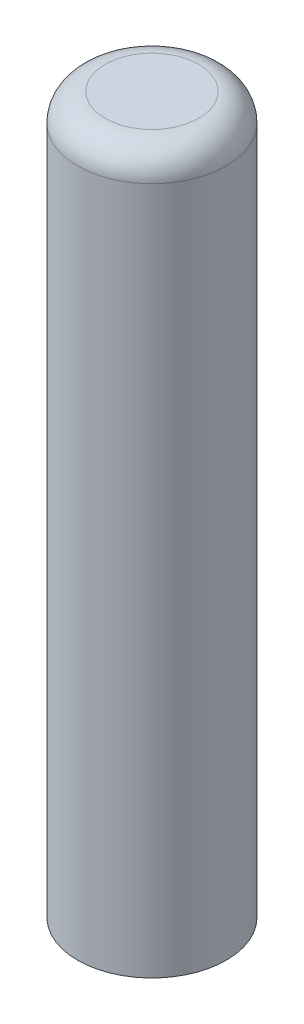
ISO-10303-21;
HEADER;
FILE_DESCRIPTION(('STEP AP214'),'2;1');
FILE_NAME('part.step','',(''),(''),'','','');
FILE_SCHEMA(('AUTOMOTIVE_DESIGN { 1 0 10303 214 1 1 1 1 }'));
ENDSEC;
DATA;
#1=APPLICATION_CONTEXT('core data for automotive mechanical design processes');
#2=APPLICATION_PROTOCOL_DEFINITION('international standard','automotive_design',2000,#1);
#3=PRODUCT_CONTEXT('',#1,'mechanical');
#4=PRODUCT('Part','Part','',(#3));
#5=PRODUCT_RELATED_PRODUCT_CATEGORY('part','',(#4));
#6=PRODUCT_DEFINITION_FORMATION('','',#4);
#7=PRODUCT_DEFINITION_CONTEXT('part definition',#1,'design');
#8=PRODUCT_DEFINITION('design','',#6,#7);
#9=PRODUCT_DEFINITION_SHAPE('','',#8);
#10=(LENGTH_UNIT() NAMED_UNIT(*) SI_UNIT(.MILLI.,.METRE.));
#11=(NAMED_UNIT(*) PLANE_ANGLE_UNIT() SI_UNIT($,.RADIAN.));
#12=(NAMED_UNIT(*) SI_UNIT($,.STERADIAN.) SOLID_ANGLE_UNIT());
#13=UNCERTAINTY_MEASURE_WITH_UNIT(LENGTH_MEASURE(1.E-05),#10,'distance_accuracy_value','');
#14=(GEOMETRIC_REPRESENTATION_CONTEXT(3) GLOBAL_UNCERTAINTY_ASSIGNED_CONTEXT((#13)) GLOBAL_UNIT_ASSIGNED_CONTEXT((#10,
#11,#12)) REPRESENTATION_CONTEXT('',''));
#15=CARTESIAN_POINT('',(0.,0.,0.));
#16=DIRECTION('',(0.,0.,1.));
#17=DIRECTION('',(1.,0.,0.));
#18=AXIS2_PLACEMENT_3D('',#15,#16,#17);
#19=CARTESIAN_POINT('',(0.,-5.,0.));
#20=DIRECTION('',(0.,1.,0.));
#21=DIRECTION('',(0.,0.,1.));
#22=AXIS2_PLACEMENT_3D('',#19,#20,#21);
#23=CYLINDRICAL_SURFACE('',#22,1.35);
#24=CARTESIAN_POINT('',(0.,7.5,0.));
#25=DIRECTION('',(0.,1.,0.));
#26=DIRECTION('',(0.,0.,1.));
#27=AXIS2_PLACEMENT_3D('',#24,#25,#26);
#28=CIRCLE('',#27,1.35);
#29=CARTESIAN_POINT('',(0.,7.5,1.35));
#30=VERTEX_POINT('',#29);
#31=EDGE_CURVE('E10',#30,#30,#28,.F.);
#32=ORIENTED_EDGE('',*,*,#31,.T.);
#33=EDGE_LOOP('',(#32));
#34=FACE_BOUND('',#33,.T.);
#35=CARTESIAN_POINT('',(0.,-5.,0.));
#36=DIRECTION('',(0.,1.,0.));
#37=DIRECTION('',(0.,0.,1.));
#38=AXIS2_PLACEMENT_3D('',#35,#36,#37);
#39=CIRCLE('',#38,1.35);
#40=CARTESIAN_POINT('',(0.,-5.,1.35));
#41=VERTEX_POINT('',#40);
#42=EDGE_CURVE('E44',#41,#41,#39,.T.);
#43=ORIENTED_EDGE('',*,*,#42,.T.);
#44=EDGE_LOOP('',(#43));
#45=FACE_BOUND('',#44,.T.);
#46=ADVANCED_FACE('F33',(#34,#45),#23,.T.);
#47=CARTESIAN_POINT('',(0.,-5.,0.));
#48=DIRECTION('',(0.,1.,0.));
#49=DIRECTION('',(0.,0.,1.));
#50=AXIS2_PLACEMENT_3D('',#47,#48,#49);
#51=PLANE('',#50);
#52=ORIENTED_EDGE('',*,*,#42,.F.);
#53=EDGE_LOOP('',(#52));
#54=FACE_BOUND('',#53,.T.);
#55=ADVANCED_FACE('F52',(#54),#51,.F.);
#56=CARTESIAN_POINT('',(0.,8.,0.));
#57=DIRECTION('',(0.,1.,0.));
#58=DIRECTION('',(0.,0.,1.));
#59=AXIS2_PLACEMENT_3D('',#56,#57,#58);
#60=PLANE('',#59);
#61=CARTESIAN_POINT('',(0.,8.,0.));
#62=DIRECTION('',(0.,1.,0.));
#63=DIRECTION('',(0.,0.,1.));
#64=AXIS2_PLACEMENT_3D('',#61,#62,#63);
#65=CIRCLE('',#64,0.85);
#66=CARTESIAN_POINT('',(0.,8.,0.85));
#67=VERTEX_POINT('',#66);
#68=EDGE_CURVE('E40',#67,#67,#65,.T.);
#69=ORIENTED_EDGE('',*,*,#68,.T.);
#70=EDGE_LOOP('',(#69));
#71=FACE_BOUND('',#70,.T.);
#72=ADVANCED_FACE('F54',(#71),#60,.T.);
#73=CARTESIAN_POINT('',(0.,7.5,0.));
#74=DIRECTION('',(0.,1.,0.));
#75=DIRECTION('',(0.,0.,1.));
#76=AXIS2_PLACEMENT_3D('',#73,#74,#75);
#77=TOROIDAL_SURFACE('',#76,0.85,0.5);
#78=ORIENTED_EDGE('',*,*,#31,.F.);
#79=EDGE_LOOP('',(#78));
#80=FACE_BOUND('',#79,.T.);
#81=ORIENTED_EDGE('',*,*,#68,.F.);
#82=EDGE_LOOP('',(#81));
#83=FACE_BOUND('',#82,.T.);
#84=ADVANCED_FACE('F35',(#80,#83),#77,.T.);
#85=CLOSED_SHELL('',(#46,#55,#72,#84));
#86=MANIFOLD_SOLID_BREP('B2',#85);
#87=ADVANCED_BREP_SHAPE_REPRESENTATION('',(#18,#86),#14);
#88=SHAPE_DEFINITION_REPRESENTATION(#9,#87);
ENDSEC;
END-ISO-10303-21;
